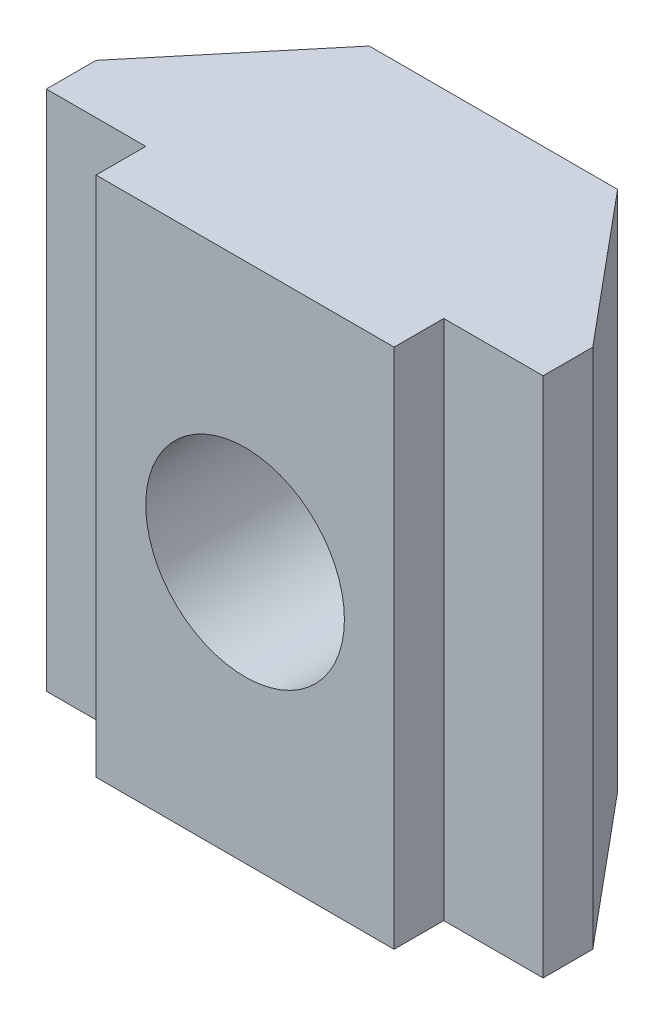
ISO-10303-21;
HEADER;
FILE_DESCRIPTION(('STEP AP214'),'2;1');
FILE_NAME('part.step','',(''),(''),'','','');
FILE_SCHEMA(('AUTOMOTIVE_DESIGN { 1 0 10303 214 1 1 1 1 }'));
ENDSEC;
DATA;
#1=APPLICATION_CONTEXT('core data for automotive mechanical design processes');
#2=APPLICATION_PROTOCOL_DEFINITION('international standard','automotive_design',2000,#1);
#3=PRODUCT_CONTEXT('',#1,'mechanical');
#4=PRODUCT('Part','Part','',(#3));
#5=PRODUCT_RELATED_PRODUCT_CATEGORY('part','',(#4));
#6=PRODUCT_DEFINITION_FORMATION('','',#4);
#7=PRODUCT_DEFINITION_CONTEXT('part definition',#1,'design');
#8=PRODUCT_DEFINITION('design','',#6,#7);
#9=PRODUCT_DEFINITION_SHAPE('','',#8);
#10=(LENGTH_UNIT() NAMED_UNIT(*) SI_UNIT(.MILLI.,.METRE.));
#11=(NAMED_UNIT(*) PLANE_ANGLE_UNIT() SI_UNIT($,.RADIAN.));
#12=(NAMED_UNIT(*) SI_UNIT($,.STERADIAN.) SOLID_ANGLE_UNIT());
#13=UNCERTAINTY_MEASURE_WITH_UNIT(LENGTH_MEASURE(1.E-05),#10,'distance_accuracy_value','');
#14=(GEOMETRIC_REPRESENTATION_CONTEXT(3) GLOBAL_UNCERTAINTY_ASSIGNED_CONTEXT((#13)) GLOBAL_UNIT_ASSIGNED_CONTEXT((#10,
#11,#12)) REPRESENTATION_CONTEXT('',''));
#15=CARTESIAN_POINT('',(0.,0.,0.));
#16=DIRECTION('',(0.,0.,1.));
#17=DIRECTION('',(1.,0.,0.));
#18=AXIS2_PLACEMENT_3D('',#15,#16,#17);
#19=CARTESIAN_POINT('',(5.,5.25,0.));
#20=DIRECTION('',(1.,0.,0.));
#21=DIRECTION('',(0.,1.,0.));
#22=AXIS2_PLACEMENT_3D('',#19,#20,#21);
#23=PLANE('',#22);
#24=DIRECTION('',(0.,-1.,0.));
#25=VECTOR('',#24,1.);
#26=CARTESIAN_POINT('',(5.,5.25,0.));
#27=LINE('',#26,#25);
#28=CARTESIAN_POINT('',(5.,5.25,0.));
#29=VERTEX_POINT('',#28);
#30=CARTESIAN_POINT('',(5.,-5.25,0.));
#31=VERTEX_POINT('',#30);
#32=EDGE_CURVE('E209',#29,#31,#27,.T.);
#33=ORIENTED_EDGE('',*,*,#32,.T.);
#34=DIRECTION('',(0.,0.,-1.));
#35=VECTOR('',#34,1.);
#36=CARTESIAN_POINT('',(5.,-5.25,0.));
#37=LINE('',#36,#35);
#38=CARTESIAN_POINT('',(5.,-5.25,-1.));
#39=VERTEX_POINT('',#38);
#40=EDGE_CURVE('E204',#31,#39,#37,.T.);
#41=ORIENTED_EDGE('',*,*,#40,.T.);
#42=DIRECTION('',(0.,-1.,0.));
#43=VECTOR('',#42,1.);
#44=CARTESIAN_POINT('',(5.,5.25,-1.));
#45=LINE('',#44,#43);
#46=CARTESIAN_POINT('',(5.,5.25,-1.));
#47=VERTEX_POINT('',#46);
#48=EDGE_CURVE('E11',#47,#39,#45,.T.);
#49=ORIENTED_EDGE('',*,*,#48,.F.);
#50=DIRECTION('',(0.,0.,-1.));
#51=VECTOR('',#50,1.);
#52=CARTESIAN_POINT('',(5.,5.25,0.));
#53=LINE('',#52,#51);
#54=EDGE_CURVE('E173',#29,#47,#53,.T.);
#55=ORIENTED_EDGE('',*,*,#54,.F.);
#56=EDGE_LOOP('',(#33,#41,#49,#55));
#57=FACE_BOUND('',#56,.T.);
#58=ADVANCED_FACE('F44',(#57),#23,.T.);
#59=CARTESIAN_POINT('',(5.,5.25,-1.));
#60=DIRECTION('',(0.768221279597458,0.,-0.640184399664382));
#61=DIRECTION('',(0.,-1.,0.));
#62=AXIS2_PLACEMENT_3D('',#59,#60,#61);
#63=PLANE('',#62);
#64=ORIENTED_EDGE('',*,*,#48,.T.);
#65=DIRECTION('',(-0.640184399664382,0.,-0.768221279597458));
#66=VECTOR('',#65,1.);
#67=CARTESIAN_POINT('',(5.,-5.25,-1.));
#68=LINE('',#67,#66);
#69=CARTESIAN_POINT('',(2.5,-5.25,-4.));
#70=VERTEX_POINT('',#69);
#71=EDGE_CURVE('E202',#39,#70,#68,.T.);
#72=ORIENTED_EDGE('',*,*,#71,.T.);
#73=DIRECTION('',(0.,-1.,0.));
#74=VECTOR('',#73,1.);
#75=CARTESIAN_POINT('',(2.5,5.25,-4.));
#76=LINE('',#75,#74);
#77=CARTESIAN_POINT('',(2.5,0.,-4.));
#78=VERTEX_POINT('',#77);
#79=EDGE_CURVE('E52',#78,#70,#76,.T.);
#80=ORIENTED_EDGE('',*,*,#79,.F.);
#81=DIRECTION('',(0.,-1.,0.));
#82=VECTOR('',#81,1.);
#83=CARTESIAN_POINT('',(2.5,5.25,-4.));
#84=LINE('',#83,#82);
#85=CARTESIAN_POINT('',(2.5,5.25,-4.));
#86=VERTEX_POINT('',#85);
#87=EDGE_CURVE('E211',#86,#78,#84,.T.);
#88=ORIENTED_EDGE('',*,*,#87,.F.);
#89=DIRECTION('',(-0.640184399664382,0.,-0.768221279597458));
#90=VECTOR('',#89,1.);
#91=CARTESIAN_POINT('',(5.,5.25,-1.));
#92=LINE('',#91,#90);
#93=EDGE_CURVE('E178',#47,#86,#92,.T.);
#94=ORIENTED_EDGE('',*,*,#93,.F.);
#95=EDGE_LOOP('',(#64,#72,#80,#88,#94));
#96=FACE_BOUND('',#95,.T.);
#97=ADVANCED_FACE('F221',(#96),#63,.T.);
#98=CARTESIAN_POINT('',(-2.5,5.25,-4.));
#99=DIRECTION('',(0.,0.,1.));
#100=DIRECTION('',(0.,-1.,0.));
#101=AXIS2_PLACEMENT_3D('',#98,#99,#100);
#102=PLANE('',#101);
#103=CARTESIAN_POINT('',(0.,0.,-4.));
#104=DIRECTION('',(0.,0.,1.));
#105=DIRECTION('',(1.,0.,0.));
#106=AXIS2_PLACEMENT_3D('',#103,#104,#105);
#107=CIRCLE('',#106,2.);
#108=CARTESIAN_POINT('',(2.,0.,-4.));
#109=VERTEX_POINT('',#108);
#110=EDGE_CURVE('E154',#109,#109,#107,.T.);
#111=ORIENTED_EDGE('',*,*,#110,.T.);
#112=EDGE_LOOP('',(#111));
#113=FACE_BOUND('',#112,.T.);
#114=DIRECTION('',(1.,0.,0.));
#115=VECTOR('',#114,1.);
#116=CARTESIAN_POINT('',(-2.5,5.25,-4.));
#117=LINE('',#116,#115);
#118=CARTESIAN_POINT('',(-2.5,5.25,-4.));
#119=VERTEX_POINT('',#118);
#120=EDGE_CURVE('E181',#119,#86,#117,.T.);
#121=ORIENTED_EDGE('',*,*,#120,.T.);
#122=ORIENTED_EDGE('',*,*,#87,.T.);
#123=ORIENTED_EDGE('',*,*,#79,.T.);
#124=DIRECTION('',(1.,0.,0.));
#125=VECTOR('',#124,1.);
#126=CARTESIAN_POINT('',(-2.5,-5.25,-4.));
#127=LINE('',#126,#125);
#128=CARTESIAN_POINT('',(-2.5,-5.25,-4.));
#129=VERTEX_POINT('',#128);
#130=EDGE_CURVE('E199',#129,#70,#127,.T.);
#131=ORIENTED_EDGE('',*,*,#130,.F.);
#132=DIRECTION('',(0.,-1.,0.));
#133=VECTOR('',#132,1.);
#134=CARTESIAN_POINT('',(-2.5,5.25,-4.));
#135=LINE('',#134,#133);
#136=CARTESIAN_POINT('',(-2.5,0.,-4.));
#137=VERTEX_POINT('',#136);
#138=EDGE_CURVE('E66',#137,#129,#135,.T.);
#139=ORIENTED_EDGE('',*,*,#138,.F.);
#140=DIRECTION('',(0.,-1.,0.));
#141=VECTOR('',#140,1.);
#142=CARTESIAN_POINT('',(-2.5,5.25,-4.));
#143=LINE('',#142,#141);
#144=EDGE_CURVE('E217',#119,#137,#143,.T.);
#145=ORIENTED_EDGE('',*,*,#144,.F.);
#146=EDGE_LOOP('',(#121,#122,#123,#131,#139,#145));
#147=FACE_BOUND('',#146,.T.);
#148=ADVANCED_FACE('F46',(#113,#147),#102,.F.);
#149=CARTESIAN_POINT('',(-5.,5.25,-1.));
#150=DIRECTION('',(0.768221279597458,0.,0.640184399664382));
#151=DIRECTION('',(0.,-1.,0.));
#152=AXIS2_PLACEMENT_3D('',#149,#150,#151);
#153=PLANE('',#152);
#154=DIRECTION('',(0.640184399664382,0.,-0.768221279597458));
#155=VECTOR('',#154,1.);
#156=CARTESIAN_POINT('',(-5.,5.25,-1.));
#157=LINE('',#156,#155);
#158=CARTESIAN_POINT('',(-5.,5.25,-1.));
#159=VERTEX_POINT('',#158);
#160=EDGE_CURVE('E176',#159,#119,#157,.T.);
#161=ORIENTED_EDGE('',*,*,#160,.T.);
#162=ORIENTED_EDGE('',*,*,#144,.T.);
#163=ORIENTED_EDGE('',*,*,#138,.T.);
#164=DIRECTION('',(0.640184399664382,0.,-0.768221279597458));
#165=VECTOR('',#164,1.);
#166=CARTESIAN_POINT('',(-5.,-5.25,-1.));
#167=LINE('',#166,#165);
#168=CARTESIAN_POINT('',(-5.,-5.25,-1.));
#169=VERTEX_POINT('',#168);
#170=EDGE_CURVE('E196',#169,#129,#167,.T.);
#171=ORIENTED_EDGE('',*,*,#170,.F.);
#172=DIRECTION('',(0.,-1.,0.));
#173=VECTOR('',#172,1.);
#174=CARTESIAN_POINT('',(-5.,5.25,-1.));
#175=LINE('',#174,#173);
#176=EDGE_CURVE('E214',#159,#169,#175,.T.);
#177=ORIENTED_EDGE('',*,*,#176,.F.);
#178=EDGE_LOOP('',(#161,#162,#163,#171,#177));
#179=FACE_BOUND('',#178,.T.);
#180=ADVANCED_FACE('F232',(#179),#153,.F.);
#181=CARTESIAN_POINT('',(-5.,5.25,0.));
#182=DIRECTION('',(1.,0.,0.));
#183=DIRECTION('',(0.,1.,0.));
#184=AXIS2_PLACEMENT_3D('',#181,#182,#183);
#185=PLANE('',#184);
#186=DIRECTION('',(0.,0.,-1.));
#187=VECTOR('',#186,1.);
#188=CARTESIAN_POINT('',(-5.,5.25,0.));
#189=LINE('',#188,#187);
#190=CARTESIAN_POINT('',(-5.,5.25,0.));
#191=VERTEX_POINT('',#190);
#192=EDGE_CURVE('E170',#191,#159,#189,.T.);
#193=ORIENTED_EDGE('',*,*,#192,.T.);
#194=ORIENTED_EDGE('',*,*,#176,.T.);
#195=DIRECTION('',(0.,0.,-1.));
#196=VECTOR('',#195,1.);
#197=CARTESIAN_POINT('',(-5.,-5.25,0.));
#198=LINE('',#197,#196);
#199=CARTESIAN_POINT('',(-5.,-5.25,0.));
#200=VERTEX_POINT('',#199);
#201=EDGE_CURVE('E193',#200,#169,#198,.T.);
#202=ORIENTED_EDGE('',*,*,#201,.F.);
#203=DIRECTION('',(0.,-1.,0.));
#204=VECTOR('',#203,1.);
#205=CARTESIAN_POINT('',(-5.,5.25,0.));
#206=LINE('',#205,#204);
#207=EDGE_CURVE('E212',#191,#200,#206,.T.);
#208=ORIENTED_EDGE('',*,*,#207,.F.);
#209=EDGE_LOOP('',(#193,#194,#202,#208));
#210=FACE_BOUND('',#209,.T.);
#211=ADVANCED_FACE('F236',(#210),#185,.F.);
#212=CARTESIAN_POINT('',(-3.,5.25,0.));
#213=DIRECTION('',(0.,0.,-1.));
#214=DIRECTION('',(0.,-1.,0.));
#215=AXIS2_PLACEMENT_3D('',#212,#213,#214);
#216=PLANE('',#215);
#217=DIRECTION('',(-1.,0.,0.));
#218=VECTOR('',#217,1.);
#219=CARTESIAN_POINT('',(-3.,5.25,0.));
#220=LINE('',#219,#218);
#221=CARTESIAN_POINT('',(-3.,5.25,0.));
#222=VERTEX_POINT('',#221);
#223=EDGE_CURVE('E167',#222,#191,#220,.T.);
#224=ORIENTED_EDGE('',*,*,#223,.T.);
#225=ORIENTED_EDGE('',*,*,#207,.T.);
#226=DIRECTION('',(-1.,0.,0.));
#227=VECTOR('',#226,1.);
#228=CARTESIAN_POINT('',(-3.,-5.25,0.));
#229=LINE('',#228,#227);
#230=CARTESIAN_POINT('',(-3.,-5.25,0.));
#231=VERTEX_POINT('',#230);
#232=EDGE_CURVE('E190',#231,#200,#229,.T.);
#233=ORIENTED_EDGE('',*,*,#232,.F.);
#234=DIRECTION('',(0.,-1.,0.));
#235=VECTOR('',#234,1.);
#236=CARTESIAN_POINT('',(-3.,5.25,0.));
#237=LINE('',#236,#235);
#238=EDGE_CURVE('E207',#222,#231,#237,.T.);
#239=ORIENTED_EDGE('',*,*,#238,.F.);
#240=EDGE_LOOP('',(#224,#225,#233,#239));
#241=FACE_BOUND('',#240,.T.);
#242=ADVANCED_FACE('F239',(#241),#216,.F.);
#243=CARTESIAN_POINT('',(5.,5.25,0.));
#244=DIRECTION('',(0.,0.,-1.));
#245=DIRECTION('',(0.,-1.,0.));
#246=AXIS2_PLACEMENT_3D('',#243,#244,#245);
#247=PLANE('',#246);
#248=DIRECTION('',(-1.,0.,0.));
#249=VECTOR('',#248,1.);
#250=CARTESIAN_POINT('',(5.,5.25,0.));
#251=LINE('',#250,#249);
#252=CARTESIAN_POINT('',(3.,5.25,0.));
#253=VERTEX_POINT('',#252);
#254=EDGE_CURVE('E165',#29,#253,#251,.T.);
#255=ORIENTED_EDGE('',*,*,#254,.T.);
#256=DIRECTION('',(0.,-1.,0.));
#257=VECTOR('',#256,1.);
#258=CARTESIAN_POINT('',(3.,5.25,0.));
#259=LINE('',#258,#257);
#260=CARTESIAN_POINT('',(3.,-5.25,0.));
#261=VERTEX_POINT('',#260);
#262=EDGE_CURVE('E133',#253,#261,#259,.T.);
#263=ORIENTED_EDGE('',*,*,#262,.T.);
#264=DIRECTION('',(-1.,0.,0.));
#265=VECTOR('',#264,1.);
#266=CARTESIAN_POINT('',(5.,-5.25,0.));
#267=LINE('',#266,#265);
#268=EDGE_CURVE('E163',#31,#261,#267,.T.);
#269=ORIENTED_EDGE('',*,*,#268,.F.);
#270=ORIENTED_EDGE('',*,*,#32,.F.);
#271=EDGE_LOOP('',(#255,#263,#269,#270));
#272=FACE_BOUND('',#271,.T.);
#273=ADVANCED_FACE('F243',(#272),#247,.F.);
#274=CARTESIAN_POINT('',(-3.,5.25,1.));
#275=DIRECTION('',(1.,0.,0.));
#276=DIRECTION('',(0.,1.,0.));
#277=AXIS2_PLACEMENT_3D('',#274,#275,#276);
#278=PLANE('',#277);
#279=DIRECTION('',(0.,0.,-1.));
#280=VECTOR('',#279,1.);
#281=CARTESIAN_POINT('',(-3.,5.25,1.));
#282=LINE('',#281,#280);
#283=CARTESIAN_POINT('',(-3.,5.25,1.));
#284=VERTEX_POINT('',#283);
#285=EDGE_CURVE('E151',#284,#222,#282,.T.);
#286=ORIENTED_EDGE('',*,*,#285,.T.);
#287=ORIENTED_EDGE('',*,*,#238,.T.);
#288=DIRECTION('',(0.,0.,-1.));
#289=VECTOR('',#288,1.);
#290=CARTESIAN_POINT('',(-3.,-5.25,1.));
#291=LINE('',#290,#289);
#292=CARTESIAN_POINT('',(-3.,-5.25,1.));
#293=VERTEX_POINT('',#292);
#294=EDGE_CURVE('E164',#293,#231,#291,.T.);
#295=ORIENTED_EDGE('',*,*,#294,.F.);
#296=DIRECTION('',(0.,-1.,0.));
#297=VECTOR('',#296,1.);
#298=CARTESIAN_POINT('',(-3.,5.25,1.));
#299=LINE('',#298,#297);
#300=EDGE_CURVE('E153',#284,#293,#299,.T.);
#301=ORIENTED_EDGE('',*,*,#300,.F.);
#302=EDGE_LOOP('',(#286,#287,#295,#301));
#303=FACE_BOUND('',#302,.T.);
#304=ADVANCED_FACE('F241',(#303),#278,.F.);
#305=CARTESIAN_POINT('',(0.,-5.25,-1.250477880476));
#306=DIRECTION('',(0.,-1.,0.));
#307=DIRECTION('',(-1.,0.,0.));
#308=AXIS2_PLACEMENT_3D('',#305,#306,#307);
#309=PLANE('',#308);
#310=ORIENTED_EDGE('',*,*,#268,.T.);
#311=DIRECTION('',(0.,0.,1.));
#312=VECTOR('',#311,1.);
#313=CARTESIAN_POINT('',(3.,-5.25,0.));
#314=LINE('',#313,#312);
#315=CARTESIAN_POINT('',(3.,-5.25,1.));
#316=VERTEX_POINT('',#315);
#317=EDGE_CURVE('E137',#261,#316,#314,.T.);
#318=ORIENTED_EDGE('',*,*,#317,.T.);
#319=DIRECTION('',(-1.,0.,0.));
#320=VECTOR('',#319,1.);
#321=CARTESIAN_POINT('',(3.,-5.25,1.));
#322=LINE('',#321,#320);
#323=EDGE_CURVE('E145',#316,#293,#322,.T.);
#324=ORIENTED_EDGE('',*,*,#323,.T.);
#325=ORIENTED_EDGE('',*,*,#294,.T.);
#326=ORIENTED_EDGE('',*,*,#232,.T.);
#327=ORIENTED_EDGE('',*,*,#201,.T.);
#328=ORIENTED_EDGE('',*,*,#170,.T.);
#329=ORIENTED_EDGE('',*,*,#130,.T.);
#330=ORIENTED_EDGE('',*,*,#71,.F.);
#331=ORIENTED_EDGE('',*,*,#40,.F.);
#332=EDGE_LOOP('',(#310,#318,#324,#325,#326,#327,#328,#329,#330,#331));
#333=FACE_BOUND('',#332,.T.);
#334=ADVANCED_FACE('F228',(#333),#309,.T.);
#335=CARTESIAN_POINT('',(0.,5.25,-1.250477880476));
#336=DIRECTION('',(0.,-1.,0.));
#337=DIRECTION('',(-1.,0.,0.));
#338=AXIS2_PLACEMENT_3D('',#335,#336,#337);
#339=PLANE('',#338);
#340=ORIENTED_EDGE('',*,*,#54,.T.);
#341=ORIENTED_EDGE('',*,*,#93,.T.);
#342=ORIENTED_EDGE('',*,*,#120,.F.);
#343=ORIENTED_EDGE('',*,*,#160,.F.);
#344=ORIENTED_EDGE('',*,*,#192,.F.);
#345=ORIENTED_EDGE('',*,*,#223,.F.);
#346=ORIENTED_EDGE('',*,*,#285,.F.);
#347=DIRECTION('',(-1.,0.,0.));
#348=VECTOR('',#347,1.);
#349=CARTESIAN_POINT('',(3.,5.25,1.));
#350=LINE('',#349,#348);
#351=CARTESIAN_POINT('',(3.,5.25,1.));
#352=VERTEX_POINT('',#351);
#353=EDGE_CURVE('E143',#352,#284,#350,.T.);
#354=ORIENTED_EDGE('',*,*,#353,.F.);
#355=DIRECTION('',(0.,0.,1.));
#356=VECTOR('',#355,1.);
#357=CARTESIAN_POINT('',(3.,5.25,0.));
#358=LINE('',#357,#356);
#359=EDGE_CURVE('E126',#253,#352,#358,.T.);
#360=ORIENTED_EDGE('',*,*,#359,.F.);
#361=ORIENTED_EDGE('',*,*,#254,.F.);
#362=EDGE_LOOP('',(#340,#341,#342,#343,#344,#345,#346,#354,#360,#361));
#363=FACE_BOUND('',#362,.T.);
#364=ADVANCED_FACE('F148',(#363),#339,.F.);
#365=CARTESIAN_POINT('',(3.,5.25,0.));
#366=DIRECTION('',(-1.,0.,0.));
#367=DIRECTION('',(0.,0.,1.));
#368=AXIS2_PLACEMENT_3D('',#365,#366,#367);
#369=PLANE('',#368);
#370=ORIENTED_EDGE('',*,*,#359,.T.);
#371=DIRECTION('',(0.,-1.,0.));
#372=VECTOR('',#371,1.);
#373=CARTESIAN_POINT('',(3.,5.25,1.));
#374=LINE('',#373,#372);
#375=EDGE_CURVE('E130',#352,#316,#374,.T.);
#376=ORIENTED_EDGE('',*,*,#375,.T.);
#377=ORIENTED_EDGE('',*,*,#317,.F.);
#378=ORIENTED_EDGE('',*,*,#262,.F.);
#379=EDGE_LOOP('',(#370,#376,#377,#378));
#380=FACE_BOUND('',#379,.T.);
#381=ADVANCED_FACE('F128',(#380),#369,.F.);
#382=CARTESIAN_POINT('',(3.,5.25,1.));
#383=DIRECTION('',(0.,0.,-1.));
#384=DIRECTION('',(0.,-1.,0.));
#385=AXIS2_PLACEMENT_3D('',#382,#383,#384);
#386=PLANE('',#385);
#387=CARTESIAN_POINT('',(0.,0.,1.));
#388=DIRECTION('',(0.,0.,1.));
#389=DIRECTION('',(1.,0.,0.));
#390=AXIS2_PLACEMENT_3D('',#387,#388,#389);
#391=CIRCLE('',#390,2.);
#392=CARTESIAN_POINT('',(2.,0.,1.));
#393=VERTEX_POINT('',#392);
#394=EDGE_CURVE('E158',#393,#393,#391,.T.);
#395=ORIENTED_EDGE('',*,*,#394,.F.);
#396=EDGE_LOOP('',(#395));
#397=FACE_BOUND('',#396,.T.);
#398=ORIENTED_EDGE('',*,*,#353,.T.);
#399=ORIENTED_EDGE('',*,*,#300,.T.);
#400=ORIENTED_EDGE('',*,*,#323,.F.);
#401=ORIENTED_EDGE('',*,*,#375,.F.);
#402=EDGE_LOOP('',(#398,#399,#400,#401));
#403=FACE_BOUND('',#402,.T.);
#404=ADVANCED_FACE('F141',(#397,#403),#386,.F.);
#405=CARTESIAN_POINT('',(0.,0.,-4.));
#406=DIRECTION('',(0.,0.,1.));
#407=DIRECTION('',(1.,0.,0.));
#408=AXIS2_PLACEMENT_3D('',#405,#406,#407);
#409=CYLINDRICAL_SURFACE('',#408,2.);
#410=ORIENTED_EDGE('',*,*,#110,.F.);
#411=EDGE_LOOP('',(#410));
#412=FACE_BOUND('',#411,.T.);
#413=ORIENTED_EDGE('',*,*,#394,.T.);
#414=EDGE_LOOP('',(#413));
#415=FACE_BOUND('',#414,.T.);
#416=ADVANCED_FACE('F268',(#412,#415),#409,.F.);
#417=CLOSED_SHELL('',(#58,#97,#148,#180,#211,#242,#273,#304,#334,#364,#381,#404,#416));
#418=MANIFOLD_SOLID_BREP('B2',#417);
#419=ADVANCED_BREP_SHAPE_REPRESENTATION('',(#18,#418),#14);
#420=SHAPE_DEFINITION_REPRESENTATION(#9,#419);
ENDSEC;
END-ISO-10303-21;
